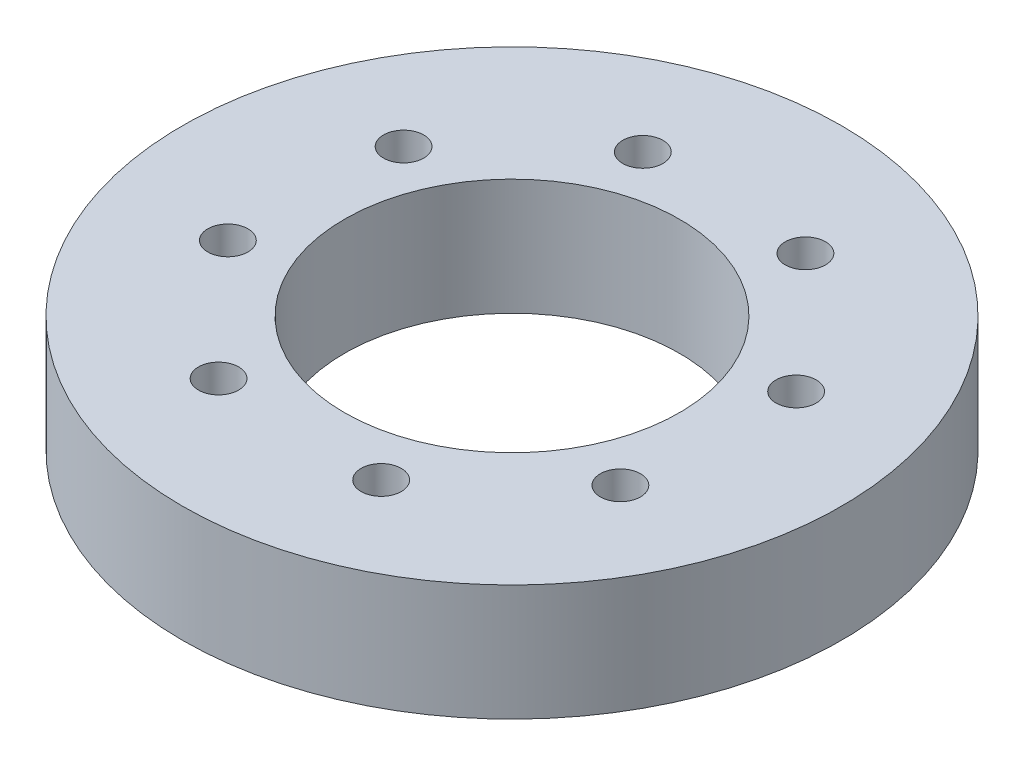
ISO-10303-21;
HEADER;
FILE_DESCRIPTION(('STEP AP214'),'2;1');
FILE_NAME('part.step','',(''),(''),'','','');
FILE_SCHEMA(('AUTOMOTIVE_DESIGN { 1 0 10303 214 1 1 1 1 }'));
ENDSEC;
DATA;
#1=APPLICATION_CONTEXT('core data for automotive mechanical design processes');
#2=APPLICATION_PROTOCOL_DEFINITION('international standard','automotive_design',2000,#1);
#3=PRODUCT_CONTEXT('',#1,'mechanical');
#4=PRODUCT('Part','Part','',(#3));
#5=PRODUCT_RELATED_PRODUCT_CATEGORY('part','',(#4));
#6=PRODUCT_DEFINITION_FORMATION('','',#4);
#7=PRODUCT_DEFINITION_CONTEXT('part definition',#1,'design');
#8=PRODUCT_DEFINITION('design','',#6,#7);
#9=PRODUCT_DEFINITION_SHAPE('','',#8);
#10=(LENGTH_UNIT() NAMED_UNIT(*) SI_UNIT(.MILLI.,.METRE.));
#11=(NAMED_UNIT(*) PLANE_ANGLE_UNIT() SI_UNIT($,.RADIAN.));
#12=(NAMED_UNIT(*) SI_UNIT($,.STERADIAN.) SOLID_ANGLE_UNIT());
#13=UNCERTAINTY_MEASURE_WITH_UNIT(LENGTH_MEASURE(1.E-05),#10,'distance_accuracy_value','');
#14=(GEOMETRIC_REPRESENTATION_CONTEXT(3) GLOBAL_UNCERTAINTY_ASSIGNED_CONTEXT((#13)) GLOBAL_UNIT_ASSIGNED_CONTEXT((#10,
#11,#12)) REPRESENTATION_CONTEXT('',''));
#15=CARTESIAN_POINT('',(0.,0.,0.));
#16=DIRECTION('',(0.,0.,1.));
#17=DIRECTION('',(1.,0.,0.));
#18=AXIS2_PLACEMENT_3D('',#15,#16,#17);
#19=CARTESIAN_POINT('',(0.,5.2,0.));
#20=DIRECTION('',(0.,1.,0.));
#21=DIRECTION('',(0.,0.,1.));
#22=AXIS2_PLACEMENT_3D('',#19,#20,#21);
#23=PLANE('',#22);
#24=CARTESIAN_POINT('',(8.99201584627861,5.2,4.14048922475043));
#25=DIRECTION('',(0.,-1.,0.));
#26=DIRECTION('',(0.707106781186539,0.,-0.707106781186556));
#27=AXIS2_PLACEMENT_3D('',#24,#25,#26);
#28=CIRCLE('',#27,0.9);
#29=CARTESIAN_POINT('',(9.6284119493465,5.2,3.50409312168252));
#30=VERTEX_POINT('',#29);
#31=EDGE_CURVE('E118',#30,#30,#28,.T.);
#32=ORIENTED_EDGE('',*,*,#31,.T.);
#33=EDGE_LOOP('',(#32));
#34=FACE_BOUND('',#33,.T.);
#35=CARTESIAN_POINT('',(3.43054737318963,5.2,9.28608338969136));
#36=DIRECTION('',(0.,-1.,0.));
#37=DIRECTION('',(1.,0.,0.));
#38=AXIS2_PLACEMENT_3D('',#35,#36,#37);
#39=CIRCLE('',#38,0.9);
#40=CARTESIAN_POINT('',(4.33054737318963,5.2,9.28608338969135));
#41=VERTEX_POINT('',#40);
#42=EDGE_CURVE('E122',#41,#41,#39,.T.);
#43=ORIENTED_EDGE('',*,*,#42,.T.);
#44=EDGE_LOOP('',(#43));
#45=FACE_BOUND('',#44,.T.);
#46=CARTESIAN_POINT('',(-4.14048922475046,5.2,8.9920158462786));
#47=DIRECTION('',(0.,-1.,0.));
#48=DIRECTION('',(0.707106781186554,0.,0.707106781186541));
#49=AXIS2_PLACEMENT_3D('',#46,#47,#48);
#50=CIRCLE('',#49,0.9);
#51=CARTESIAN_POINT('',(-3.50409312168256,5.2,9.62841194934649));
#52=VERTEX_POINT('',#51);
#53=EDGE_CURVE('E126',#52,#52,#50,.T.);
#54=ORIENTED_EDGE('',*,*,#53,.T.);
#55=EDGE_LOOP('',(#54));
#56=FACE_BOUND('',#55,.T.);
#57=CARTESIAN_POINT('',(-9.2860833896914,5.2,3.43054737318953));
#58=DIRECTION('',(0.,-1.,0.));
#59=DIRECTION('',(0.,0.,1.));
#60=AXIS2_PLACEMENT_3D('',#57,#58,#59);
#61=CIRCLE('',#60,0.9);
#62=CARTESIAN_POINT('',(-9.2860833896914,5.2,4.33054737318953));
#63=VERTEX_POINT('',#62);
#64=EDGE_CURVE('E130',#63,#63,#61,.T.);
#65=ORIENTED_EDGE('',*,*,#64,.T.);
#66=EDGE_LOOP('',(#65));
#67=FACE_BOUND('',#66,.T.);
#68=CARTESIAN_POINT('',(-8.99201584627859,5.2,-4.14048922475049));
#69=DIRECTION('',(0.,-1.,0.));
#70=DIRECTION('',(-0.707106781186544,0.,0.707106781186551));
#71=AXIS2_PLACEMENT_3D('',#68,#69,#70);
#72=CIRCLE('',#71,0.9);
#73=CARTESIAN_POINT('',(-9.62841194934648,5.2,-3.50409312168259));
#74=VERTEX_POINT('',#73);
#75=EDGE_CURVE('E134',#74,#74,#72,.T.);
#76=ORIENTED_EDGE('',*,*,#75,.T.);
#77=EDGE_LOOP('',(#76));
#78=FACE_BOUND('',#77,.T.);
#79=CARTESIAN_POINT('',(-3.43054737318956,5.2,-9.28608338969139));
#80=DIRECTION('',(0.,-1.,0.));
#81=DIRECTION('',(-1.,0.,0.));
#82=AXIS2_PLACEMENT_3D('',#79,#80,#81);
#83=CIRCLE('',#82,0.9);
#84=CARTESIAN_POINT('',(-4.33054737318956,5.2,-9.28608338969138));
#85=VERTEX_POINT('',#84);
#86=EDGE_CURVE('E138',#85,#85,#83,.T.);
#87=ORIENTED_EDGE('',*,*,#86,.T.);
#88=EDGE_LOOP('',(#87));
#89=FACE_BOUND('',#88,.T.);
#90=CARTESIAN_POINT('',(4.14048922475052,5.2,-8.99201584627857));
#91=DIRECTION('',(0.,-1.,0.));
#92=DIRECTION('',(-0.707106781186549,0.,-0.707106781186546));
#93=AXIS2_PLACEMENT_3D('',#90,#91,#92);
#94=CIRCLE('',#93,0.9);
#95=CARTESIAN_POINT('',(3.50409312168262,5.2,-9.62841194934646));
#96=VERTEX_POINT('',#95);
#97=EDGE_CURVE('E64',#96,#96,#94,.T.);
#98=ORIENTED_EDGE('',*,*,#97,.T.);
#99=EDGE_LOOP('',(#98));
#100=FACE_BOUND('',#99,.T.);
#101=CARTESIAN_POINT('',(9.2860833896914,5.2,-3.43054737318953));
#102=DIRECTION('',(0.,-1.,0.));
#103=DIRECTION('',(0.,0.,-1.));
#104=AXIS2_PLACEMENT_3D('',#101,#102,#103);
#105=CIRCLE('',#104,0.9);
#106=CARTESIAN_POINT('',(9.2860833896914,5.2,-4.33054737318953));
#107=VERTEX_POINT('',#106);
#108=EDGE_CURVE('E59',#107,#107,#105,.T.);
#109=ORIENTED_EDGE('',*,*,#108,.T.);
#110=EDGE_LOOP('',(#109));
#111=FACE_BOUND('',#110,.T.);
#112=CARTESIAN_POINT('',(0.,5.2,0.));
#113=DIRECTION('',(0.,1.,0.));
#114=DIRECTION('',(0.,0.,1.));
#115=AXIS2_PLACEMENT_3D('',#112,#113,#114);
#116=CIRCLE('',#115,14.75);
#117=CARTESIAN_POINT('',(0.,5.2,14.75));
#118=VERTEX_POINT('',#117);
#119=EDGE_CURVE('E10',#118,#118,#116,.T.);
#120=ORIENTED_EDGE('',*,*,#119,.T.);
#121=EDGE_LOOP('',(#120));
#122=FACE_BOUND('',#121,.T.);
#123=CARTESIAN_POINT('',(0.,5.2,0.));
#124=DIRECTION('',(0.,1.,0.));
#125=DIRECTION('',(0.,0.,1.));
#126=AXIS2_PLACEMENT_3D('',#123,#124,#125);
#127=CIRCLE('',#126,7.5);
#128=CARTESIAN_POINT('',(0.,5.2,7.5));
#129=VERTEX_POINT('',#128);
#130=EDGE_CURVE('E50',#129,#129,#127,.T.);
#131=ORIENTED_EDGE('',*,*,#130,.F.);
#132=EDGE_LOOP('',(#131));
#133=FACE_BOUND('',#132,.T.);
#134=ADVANCED_FACE('F37',(#34,#45,#56,#67,#78,#89,#100,#111,#122,#133),#23,.T.);
#135=CARTESIAN_POINT('',(0.,0.,0.));
#136=DIRECTION('',(0.,1.,0.));
#137=DIRECTION('',(0.,0.,1.));
#138=AXIS2_PLACEMENT_3D('',#135,#136,#137);
#139=PLANE('',#138);
#140=CARTESIAN_POINT('',(8.99201584627861,0.,4.14048922475043));
#141=DIRECTION('',(0.,1.,0.));
#142=DIRECTION('',(0.,0.,1.));
#143=AXIS2_PLACEMENT_3D('',#140,#141,#142);
#144=CIRCLE('',#143,0.9);
#145=CARTESIAN_POINT('',(8.99201584627861,0.,5.04048922475043));
#146=VERTEX_POINT('',#145);
#147=EDGE_CURVE('E41',#146,#146,#144,.T.);
#148=ORIENTED_EDGE('',*,*,#147,.T.);
#149=EDGE_LOOP('',(#148));
#150=FACE_BOUND('',#149,.T.);
#151=CARTESIAN_POINT('',(3.43054737318963,0.,9.28608338969136));
#152=DIRECTION('',(0.,1.,0.));
#153=DIRECTION('',(0.,0.,1.));
#154=AXIS2_PLACEMENT_3D('',#151,#152,#153);
#155=CIRCLE('',#154,0.9);
#156=CARTESIAN_POINT('',(3.43054737318963,0.,10.1860833896914));
#157=VERTEX_POINT('',#156);
#158=EDGE_CURVE('E75',#157,#157,#155,.T.);
#159=ORIENTED_EDGE('',*,*,#158,.T.);
#160=EDGE_LOOP('',(#159));
#161=FACE_BOUND('',#160,.T.);
#162=CARTESIAN_POINT('',(-4.14048922475046,0.,8.9920158462786));
#163=DIRECTION('',(0.,1.,0.));
#164=DIRECTION('',(0.,0.,1.));
#165=AXIS2_PLACEMENT_3D('',#162,#163,#164);
#166=CIRCLE('',#165,0.9);
#167=CARTESIAN_POINT('',(-4.14048922475046,0.,9.8920158462786));
#168=VERTEX_POINT('',#167);
#169=EDGE_CURVE('E73',#168,#168,#166,.T.);
#170=ORIENTED_EDGE('',*,*,#169,.T.);
#171=EDGE_LOOP('',(#170));
#172=FACE_BOUND('',#171,.T.);
#173=CARTESIAN_POINT('',(-9.2860833896914,0.,3.43054737318953));
#174=DIRECTION('',(0.,1.,0.));
#175=DIRECTION('',(0.,0.,1.));
#176=AXIS2_PLACEMENT_3D('',#173,#174,#175);
#177=CIRCLE('',#176,0.9);
#178=CARTESIAN_POINT('',(-9.2860833896914,0.,4.33054737318953));
#179=VERTEX_POINT('',#178);
#180=EDGE_CURVE('E70',#179,#179,#177,.T.);
#181=ORIENTED_EDGE('',*,*,#180,.T.);
#182=EDGE_LOOP('',(#181));
#183=FACE_BOUND('',#182,.T.);
#184=CARTESIAN_POINT('',(-8.99201584627859,0.,-4.14048922475049));
#185=DIRECTION('',(0.,1.,0.));
#186=DIRECTION('',(0.,0.,1.));
#187=AXIS2_PLACEMENT_3D('',#184,#185,#186);
#188=CIRCLE('',#187,0.9);
#189=CARTESIAN_POINT('',(-8.99201584627859,0.,-3.24048922475049));
#190=VERTEX_POINT('',#189);
#191=EDGE_CURVE('E67',#190,#190,#188,.T.);
#192=ORIENTED_EDGE('',*,*,#191,.T.);
#193=EDGE_LOOP('',(#192));
#194=FACE_BOUND('',#193,.T.);
#195=CARTESIAN_POINT('',(-3.43054737318956,0.,-9.28608338969139));
#196=DIRECTION('',(0.,1.,0.));
#197=DIRECTION('',(0.,0.,1.));
#198=AXIS2_PLACEMENT_3D('',#195,#196,#197);
#199=CIRCLE('',#198,0.9);
#200=CARTESIAN_POINT('',(-3.43054737318956,0.,-8.38608338969139));
#201=VERTEX_POINT('',#200);
#202=EDGE_CURVE('E63',#201,#201,#199,.T.);
#203=ORIENTED_EDGE('',*,*,#202,.T.);
#204=EDGE_LOOP('',(#203));
#205=FACE_BOUND('',#204,.T.);
#206=CARTESIAN_POINT('',(4.14048922475052,0.,-8.99201584627857));
#207=DIRECTION('',(0.,1.,0.));
#208=DIRECTION('',(0.,0.,1.));
#209=AXIS2_PLACEMENT_3D('',#206,#207,#208);
#210=CIRCLE('',#209,0.9);
#211=CARTESIAN_POINT('',(4.14048922475052,0.,-8.09201584627857));
#212=VERTEX_POINT('',#211);
#213=EDGE_CURVE('E60',#212,#212,#210,.T.);
#214=ORIENTED_EDGE('',*,*,#213,.T.);
#215=EDGE_LOOP('',(#214));
#216=FACE_BOUND('',#215,.T.);
#217=CARTESIAN_POINT('',(9.2860833896914,0.,-3.43054737318953));
#218=DIRECTION('',(0.,1.,0.));
#219=DIRECTION('',(0.,0.,1.));
#220=AXIS2_PLACEMENT_3D('',#217,#218,#219);
#221=CIRCLE('',#220,0.9);
#222=CARTESIAN_POINT('',(9.2860833896914,0.,-2.53054737318953));
#223=VERTEX_POINT('',#222);
#224=EDGE_CURVE('E56',#223,#223,#221,.T.);
#225=ORIENTED_EDGE('',*,*,#224,.T.);
#226=EDGE_LOOP('',(#225));
#227=FACE_BOUND('',#226,.T.);
#228=CARTESIAN_POINT('',(0.,0.,0.));
#229=DIRECTION('',(0.,1.,0.));
#230=DIRECTION('',(0.,0.,1.));
#231=AXIS2_PLACEMENT_3D('',#228,#229,#230);
#232=CIRCLE('',#231,14.75);
#233=CARTESIAN_POINT('',(0.,0.,14.75));
#234=VERTEX_POINT('',#233);
#235=EDGE_CURVE('E45',#234,#234,#232,.T.);
#236=ORIENTED_EDGE('',*,*,#235,.F.);
#237=EDGE_LOOP('',(#236));
#238=FACE_BOUND('',#237,.T.);
#239=CARTESIAN_POINT('',(0.,0.,0.));
#240=DIRECTION('',(0.,1.,0.));
#241=DIRECTION('',(0.,0.,1.));
#242=AXIS2_PLACEMENT_3D('',#239,#240,#241);
#243=CIRCLE('',#242,7.5);
#244=CARTESIAN_POINT('',(0.,0.,7.5));
#245=VERTEX_POINT('',#244);
#246=EDGE_CURVE('E53',#245,#245,#243,.T.);
#247=ORIENTED_EDGE('',*,*,#246,.T.);
#248=EDGE_LOOP('',(#247));
#249=FACE_BOUND('',#248,.T.);
#250=ADVANCED_FACE('F94',(#150,#161,#172,#183,#194,#205,#216,#227,#238,#249),#139,.F.);
#251=CARTESIAN_POINT('',(0.,5.2,0.));
#252=DIRECTION('',(0.,-1.,0.));
#253=DIRECTION('',(0.,0.,-1.));
#254=AXIS2_PLACEMENT_3D('',#251,#252,#253);
#255=CYLINDRICAL_SURFACE('',#254,14.75);
#256=ORIENTED_EDGE('',*,*,#119,.F.);
#257=EDGE_LOOP('',(#256));
#258=FACE_BOUND('',#257,.T.);
#259=ORIENTED_EDGE('',*,*,#235,.T.);
#260=EDGE_LOOP('',(#259));
#261=FACE_BOUND('',#260,.T.);
#262=ADVANCED_FACE('F39',(#258,#261),#255,.T.);
#263=CARTESIAN_POINT('',(0.,5.2,0.));
#264=DIRECTION('',(0.,-1.,0.));
#265=DIRECTION('',(0.,0.,-1.));
#266=AXIS2_PLACEMENT_3D('',#263,#264,#265);
#267=CYLINDRICAL_SURFACE('',#266,7.5);
#268=ORIENTED_EDGE('',*,*,#130,.T.);
#269=EDGE_LOOP('',(#268));
#270=FACE_BOUND('',#269,.T.);
#271=ORIENTED_EDGE('',*,*,#246,.F.);
#272=EDGE_LOOP('',(#271));
#273=FACE_BOUND('',#272,.T.);
#274=ADVANCED_FACE('F96',(#270,#273),#267,.F.);
#275=CARTESIAN_POINT('',(9.2860833896914,5.2,-3.43054737318953));
#276=DIRECTION('',(0.,-1.,0.));
#277=DIRECTION('',(0.,0.,-1.));
#278=AXIS2_PLACEMENT_3D('',#275,#276,#277);
#279=CYLINDRICAL_SURFACE('',#278,0.9);
#280=ORIENTED_EDGE('',*,*,#108,.F.);
#281=EDGE_LOOP('',(#280));
#282=FACE_BOUND('',#281,.T.);
#283=ORIENTED_EDGE('',*,*,#224,.F.);
#284=EDGE_LOOP('',(#283));
#285=FACE_BOUND('',#284,.T.);
#286=ADVANCED_FACE('F98',(#282,#285),#279,.F.);
#287=CARTESIAN_POINT('',(4.14048922475052,5.2,-8.99201584627857));
#288=DIRECTION('',(0.,-1.,0.));
#289=DIRECTION('',(0.,0.,-1.));
#290=AXIS2_PLACEMENT_3D('',#287,#288,#289);
#291=CYLINDRICAL_SURFACE('',#290,0.9);
#292=ORIENTED_EDGE('',*,*,#97,.F.);
#293=EDGE_LOOP('',(#292));
#294=FACE_BOUND('',#293,.T.);
#295=ORIENTED_EDGE('',*,*,#213,.F.);
#296=EDGE_LOOP('',(#295));
#297=FACE_BOUND('',#296,.T.);
#298=ADVANCED_FACE('F104',(#294,#297),#291,.F.);
#299=CARTESIAN_POINT('',(-3.43054737318956,5.2,-9.28608338969139));
#300=DIRECTION('',(0.,-1.,0.));
#301=DIRECTION('',(0.,0.,-1.));
#302=AXIS2_PLACEMENT_3D('',#299,#300,#301);
#303=CYLINDRICAL_SURFACE('',#302,0.9);
#304=ORIENTED_EDGE('',*,*,#86,.F.);
#305=EDGE_LOOP('',(#304));
#306=FACE_BOUND('',#305,.T.);
#307=ORIENTED_EDGE('',*,*,#202,.F.);
#308=EDGE_LOOP('',(#307));
#309=FACE_BOUND('',#308,.T.);
#310=ADVANCED_FACE('F150',(#306,#309),#303,.F.);
#311=CARTESIAN_POINT('',(-8.99201584627859,5.2,-4.14048922475049));
#312=DIRECTION('',(0.,-1.,0.));
#313=DIRECTION('',(0.,0.,-1.));
#314=AXIS2_PLACEMENT_3D('',#311,#312,#313);
#315=CYLINDRICAL_SURFACE('',#314,0.9);
#316=ORIENTED_EDGE('',*,*,#75,.F.);
#317=EDGE_LOOP('',(#316));
#318=FACE_BOUND('',#317,.T.);
#319=ORIENTED_EDGE('',*,*,#191,.F.);
#320=EDGE_LOOP('',(#319));
#321=FACE_BOUND('',#320,.T.);
#322=ADVANCED_FACE('F163',(#318,#321),#315,.F.);
#323=CARTESIAN_POINT('',(-9.2860833896914,5.2,3.43054737318953));
#324=DIRECTION('',(0.,-1.,0.));
#325=DIRECTION('',(0.,0.,-1.));
#326=AXIS2_PLACEMENT_3D('',#323,#324,#325);
#327=CYLINDRICAL_SURFACE('',#326,0.9);
#328=ORIENTED_EDGE('',*,*,#64,.F.);
#329=EDGE_LOOP('',(#328));
#330=FACE_BOUND('',#329,.T.);
#331=ORIENTED_EDGE('',*,*,#180,.F.);
#332=EDGE_LOOP('',(#331));
#333=FACE_BOUND('',#332,.T.);
#334=ADVANCED_FACE('F178',(#330,#333),#327,.F.);
#335=CARTESIAN_POINT('',(-4.14048922475046,5.2,8.9920158462786));
#336=DIRECTION('',(0.,-1.,0.));
#337=DIRECTION('',(0.,0.,-1.));
#338=AXIS2_PLACEMENT_3D('',#335,#336,#337);
#339=CYLINDRICAL_SURFACE('',#338,0.9);
#340=ORIENTED_EDGE('',*,*,#53,.F.);
#341=EDGE_LOOP('',(#340));
#342=FACE_BOUND('',#341,.T.);
#343=ORIENTED_EDGE('',*,*,#169,.F.);
#344=EDGE_LOOP('',(#343));
#345=FACE_BOUND('',#344,.T.);
#346=ADVANCED_FACE('F174',(#342,#345),#339,.F.);
#347=CARTESIAN_POINT('',(3.43054737318963,5.2,9.28608338969136));
#348=DIRECTION('',(0.,-1.,0.));
#349=DIRECTION('',(0.,0.,-1.));
#350=AXIS2_PLACEMENT_3D('',#347,#348,#349);
#351=CYLINDRICAL_SURFACE('',#350,0.9);
#352=ORIENTED_EDGE('',*,*,#42,.F.);
#353=EDGE_LOOP('',(#352));
#354=FACE_BOUND('',#353,.T.);
#355=ORIENTED_EDGE('',*,*,#158,.F.);
#356=EDGE_LOOP('',(#355));
#357=FACE_BOUND('',#356,.T.);
#358=ADVANCED_FACE('F170',(#354,#357),#351,.F.);
#359=CARTESIAN_POINT('',(8.99201584627861,5.2,4.14048922475043));
#360=DIRECTION('',(0.,-1.,0.));
#361=DIRECTION('',(0.,0.,-1.));
#362=AXIS2_PLACEMENT_3D('',#359,#360,#361);
#363=CYLINDRICAL_SURFACE('',#362,0.9);
#364=ORIENTED_EDGE('',*,*,#31,.F.);
#365=EDGE_LOOP('',(#364));
#366=FACE_BOUND('',#365,.T.);
#367=ORIENTED_EDGE('',*,*,#147,.F.);
#368=EDGE_LOOP('',(#367));
#369=FACE_BOUND('',#368,.T.);
#370=ADVANCED_FACE('F167',(#366,#369),#363,.F.);
#371=CLOSED_SHELL('',(#134,#250,#262,#274,#286,#298,#310,#322,#334,#346,#358,#370));
#372=MANIFOLD_SOLID_BREP('B2',#371);
#373=ADVANCED_BREP_SHAPE_REPRESENTATION('',(#18,#372),#14);
#374=SHAPE_DEFINITION_REPRESENTATION(#9,#373);
ENDSEC;
END-ISO-10303-21;
